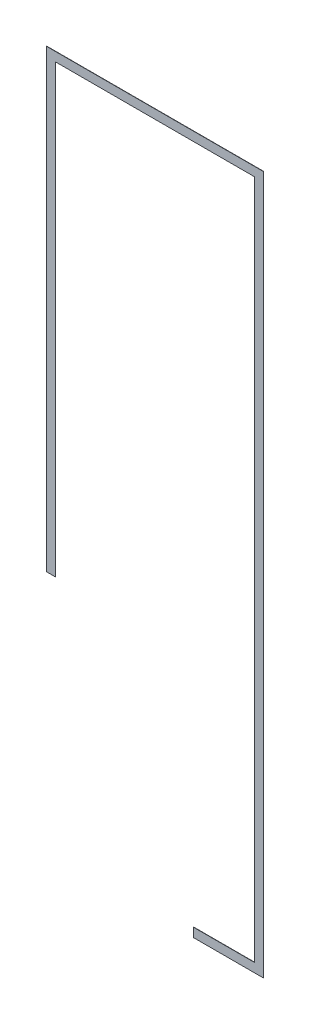
ISO-10303-21;
HEADER;
FILE_DESCRIPTION(('STEP AP214'),'2;1');
FILE_NAME('part.step','',(''),(''),'','','');
FILE_SCHEMA(('AUTOMOTIVE_DESIGN { 1 0 10303 214 1 1 1 1 }'));
ENDSEC;
DATA;
#1=APPLICATION_CONTEXT('core data for automotive mechanical design processes');
#2=APPLICATION_PROTOCOL_DEFINITION('international standard','automotive_design',2000,#1);
#3=PRODUCT_CONTEXT('',#1,'mechanical');
#4=PRODUCT('Part','Part','',(#3));
#5=PRODUCT_RELATED_PRODUCT_CATEGORY('part','',(#4));
#6=PRODUCT_DEFINITION_FORMATION('','',#4);
#7=PRODUCT_DEFINITION_CONTEXT('part definition',#1,'design');
#8=PRODUCT_DEFINITION('design','',#6,#7);
#9=PRODUCT_DEFINITION_SHAPE('','',#8);
#10=(LENGTH_UNIT() NAMED_UNIT(*) SI_UNIT(.MILLI.,.METRE.));
#11=(NAMED_UNIT(*) PLANE_ANGLE_UNIT() SI_UNIT($,.RADIAN.));
#12=(NAMED_UNIT(*) SI_UNIT($,.STERADIAN.) SOLID_ANGLE_UNIT());
#13=UNCERTAINTY_MEASURE_WITH_UNIT(LENGTH_MEASURE(1.E-05),#10,'distance_accuracy_value','');
#14=(GEOMETRIC_REPRESENTATION_CONTEXT(3) GLOBAL_UNCERTAINTY_ASSIGNED_CONTEXT((#13)) GLOBAL_UNIT_ASSIGNED_CONTEXT((#10,
#11,#12)) REPRESENTATION_CONTEXT('',''));
#15=CARTESIAN_POINT('',(0.,0.,0.));
#16=DIRECTION('',(0.,0.,1.));
#17=DIRECTION('',(1.,0.,0.));
#18=AXIS2_PLACEMENT_3D('',#15,#16,#17);
#19=CARTESIAN_POINT('',(5890.08691054199,-2228.56735908509,1.5875));
#20=DIRECTION('',(0.,0.,1.));
#21=DIRECTION('',(1.,0.,0.));
#22=AXIS2_PLACEMENT_3D('',#19,#20,#21);
#23=PLANE('',#22);
#24=DIRECTION('',(0.,1.,0.));
#25=VECTOR('',#24,1.);
#26=CARTESIAN_POINT('',(6108.37451054199,-4171.66735908507,1.5875));
#27=LINE('',#26,#25);
#28=CARTESIAN_POINT('',(6108.37451054199,-4197.06735908507,1.5875));
#29=VERTEX_POINT('',#28);
#30=CARTESIAN_POINT('',(6108.37451054199,-4146.26735908507,1.5875));
#31=VERTEX_POINT('',#30);
#32=EDGE_CURVE('E130',#29,#31,#27,.T.);
#33=ORIENTED_EDGE('',*,*,#32,.F.);
#34=DIRECTION('',(1.,0.,0.));
#35=VECTOR('',#34,1.);
#36=CARTESIAN_POINT('',(6305.22451054199,-4197.06735908507,1.5875));
#37=LINE('',#36,#35);
#38=CARTESIAN_POINT('',(6502.07451054199,-4197.06735908507,1.5875));
#39=VERTEX_POINT('',#38);
#40=EDGE_CURVE('E134',#39,#29,#37,.F.);
#41=ORIENTED_EDGE('',*,*,#40,.F.);
#42=DIRECTION('',(0.,1.,0.));
#43=VECTOR('',#42,1.);
#44=CARTESIAN_POINT('',(6502.07451054199,-2228.56735908509,1.5875));
#45=LINE('',#44,#43);
#46=CARTESIAN_POINT('',(6502.07451054199,-260.067359085082,1.5875));
#47=VERTEX_POINT('',#46);
#48=EDGE_CURVE('E138',#47,#39,#45,.F.);
#49=ORIENTED_EDGE('',*,*,#48,.F.);
#50=DIRECTION('',(-1.,0.,0.));
#51=VECTOR('',#50,1.);
#52=CARTESIAN_POINT('',(5890.08691054199,-260.067359085082,1.5875));
#53=LINE('',#52,#51);
#54=CARTESIAN_POINT('',(5278.09931054199,-260.067359085082,1.5875));
#55=VERTEX_POINT('',#54);
#56=EDGE_CURVE('E107',#55,#47,#53,.F.);
#57=ORIENTED_EDGE('',*,*,#56,.F.);
#58=DIRECTION('',(0.,1.,0.));
#59=VECTOR('',#58,1.);
#60=CARTESIAN_POINT('',(5278.09931054199,-1542.76735908508,1.5875));
#61=LINE('',#60,#59);
#62=CARTESIAN_POINT('',(5278.09931054199,-2825.46735908507,1.5875));
#63=VERTEX_POINT('',#62);
#64=EDGE_CURVE('E20',#63,#55,#61,.T.);
#65=ORIENTED_EDGE('',*,*,#64,.F.);
#66=DIRECTION('',(1.,0.,0.));
#67=VECTOR('',#66,1.);
#68=CARTESIAN_POINT('',(5303.49931054199,-2825.46735908507,1.5875));
#69=LINE('',#68,#67);
#70=CARTESIAN_POINT('',(5328.89931054199,-2825.46735908507,1.5875));
#71=VERTEX_POINT('',#70);
#72=EDGE_CURVE('E95',#71,#63,#69,.F.);
#73=ORIENTED_EDGE('',*,*,#72,.F.);
#74=DIRECTION('',(0.,1.,0.));
#75=VECTOR('',#74,1.);
#76=CARTESIAN_POINT('',(5328.89931054199,-1568.16735908509,1.5875));
#77=LINE('',#76,#75);
#78=CARTESIAN_POINT('',(5328.89931054199,-310.867359085082,1.5875));
#79=VERTEX_POINT('',#78);
#80=EDGE_CURVE('E90',#79,#71,#77,.F.);
#81=ORIENTED_EDGE('',*,*,#80,.F.);
#82=DIRECTION('',(1.,0.,0.));
#83=VECTOR('',#82,1.);
#84=CARTESIAN_POINT('',(5890.08691054199,-310.867359085082,1.5875));
#85=LINE('',#84,#83);
#86=CARTESIAN_POINT('',(6451.27451054199,-310.867359085082,1.5875));
#87=VERTEX_POINT('',#86);
#88=EDGE_CURVE('E118',#87,#79,#85,.F.);
#89=ORIENTED_EDGE('',*,*,#88,.F.);
#90=DIRECTION('',(0.,-1.,0.));
#91=VECTOR('',#90,1.);
#92=CARTESIAN_POINT('',(6451.27451054199,-2228.56735908509,1.5875));
#93=LINE('',#92,#91);
#94=CARTESIAN_POINT('',(6451.27451054199,-4146.26735908507,1.5875));
#95=VERTEX_POINT('',#94);
#96=EDGE_CURVE('E122',#95,#87,#93,.F.);
#97=ORIENTED_EDGE('',*,*,#96,.F.);
#98=DIRECTION('',(1.,0.,0.));
#99=VECTOR('',#98,1.);
#100=CARTESIAN_POINT('',(6279.82451054199,-4146.26735908507,1.5875));
#101=LINE('',#100,#99);
#102=EDGE_CURVE('E126',#31,#95,#101,.T.);
#103=ORIENTED_EDGE('',*,*,#102,.F.);
#104=EDGE_LOOP('',(#33,#41,#49,#57,#65,#73,#81,#89,#97,#103));
#105=FACE_BOUND('',#104,.T.);
#106=ADVANCED_FACE('F17',(#105),#23,.T.);
#107=CARTESIAN_POINT('',(5278.09931054199,-1542.76735908508,6.35));
#108=DIRECTION('',(-1.,0.,0.));
#109=DIRECTION('',(0.,0.,1.));
#110=AXIS2_PLACEMENT_3D('',#107,#108,#109);
#111=PLANE('',#110);
#112=DIRECTION('',(0.,1.,0.));
#113=VECTOR('',#112,1.);
#114=CARTESIAN_POINT('',(5278.09931054199,-2228.56735908509,0.));
#115=LINE('',#114,#113);
#116=CARTESIAN_POINT('',(5278.09931054199,-260.067359085082,0.));
#117=VERTEX_POINT('',#116);
#118=CARTESIAN_POINT('',(5278.09931054199,-2825.46735908507,0.));
#119=VERTEX_POINT('',#118);
#120=EDGE_CURVE('E113',#117,#119,#115,.F.);
#121=ORIENTED_EDGE('',*,*,#120,.T.);
#122=DIRECTION('',(0.,0.,-1.));
#123=VECTOR('',#122,1.);
#124=CARTESIAN_POINT('',(5278.09931054199,-2825.46735908507,6.35));
#125=LINE('',#124,#123);
#126=EDGE_CURVE('E100',#63,#119,#125,.T.);
#127=ORIENTED_EDGE('',*,*,#126,.F.);
#128=ORIENTED_EDGE('',*,*,#64,.T.);
#129=DIRECTION('',(0.,0.,1.));
#130=VECTOR('',#129,1.);
#131=CARTESIAN_POINT('',(5278.09931054199,-260.067359085083,6.35));
#132=LINE('',#131,#130);
#133=EDGE_CURVE('E144',#117,#55,#132,.T.);
#134=ORIENTED_EDGE('',*,*,#133,.F.);
#135=EDGE_LOOP('',(#121,#127,#128,#134));
#136=FACE_BOUND('',#135,.T.);
#137=ADVANCED_FACE('F112',(#136),#111,.T.);
#138=CARTESIAN_POINT('',(5303.49931054199,-2825.46735908507,6.35));
#139=DIRECTION('',(0.,-1.,0.));
#140=DIRECTION('',(0.,0.,-1.));
#141=AXIS2_PLACEMENT_3D('',#138,#139,#140);
#142=PLANE('',#141);
#143=DIRECTION('',(1.,0.,0.));
#144=VECTOR('',#143,1.);
#145=CARTESIAN_POINT('',(5890.08691054199,-2825.46735908507,0.));
#146=LINE('',#145,#144);
#147=CARTESIAN_POINT('',(5328.89931054199,-2825.46735908507,0.));
#148=VERTEX_POINT('',#147);
#149=EDGE_CURVE('E147',#119,#148,#146,.T.);
#150=ORIENTED_EDGE('',*,*,#149,.T.);
#151=DIRECTION('',(0.,0.,-1.));
#152=VECTOR('',#151,1.);
#153=CARTESIAN_POINT('',(5328.89931054199,-2825.46735908507,6.35));
#154=LINE('',#153,#152);
#155=EDGE_CURVE('E102',#71,#148,#154,.T.);
#156=ORIENTED_EDGE('',*,*,#155,.F.);
#157=ORIENTED_EDGE('',*,*,#72,.T.);
#158=ORIENTED_EDGE('',*,*,#126,.T.);
#159=EDGE_LOOP('',(#150,#156,#157,#158));
#160=FACE_BOUND('',#159,.T.);
#161=ADVANCED_FACE('F98',(#160),#142,.T.);
#162=CARTESIAN_POINT('',(5328.89931054199,-1568.16735908509,6.35));
#163=DIRECTION('',(1.,0.,0.));
#164=DIRECTION('',(0.,0.,-1.));
#165=AXIS2_PLACEMENT_3D('',#162,#163,#164);
#166=PLANE('',#165);
#167=DIRECTION('',(0.,1.,0.));
#168=VECTOR('',#167,1.);
#169=CARTESIAN_POINT('',(5328.89931054199,-2228.56735908509,0.));
#170=LINE('',#169,#168);
#171=CARTESIAN_POINT('',(5328.89931054199,-310.867359085082,0.));
#172=VERTEX_POINT('',#171);
#173=EDGE_CURVE('E149',#148,#172,#170,.T.);
#174=ORIENTED_EDGE('',*,*,#173,.T.);
#175=DIRECTION('',(0.,0.,1.));
#176=VECTOR('',#175,1.);
#177=CARTESIAN_POINT('',(5328.89931054199,-310.867359085082,6.35));
#178=LINE('',#177,#176);
#179=EDGE_CURVE('E120',#79,#172,#178,.F.);
#180=ORIENTED_EDGE('',*,*,#179,.F.);
#181=ORIENTED_EDGE('',*,*,#80,.T.);
#182=ORIENTED_EDGE('',*,*,#155,.T.);
#183=EDGE_LOOP('',(#174,#180,#181,#182));
#184=FACE_BOUND('',#183,.T.);
#185=ADVANCED_FACE('F198',(#184),#166,.T.);
#186=CARTESIAN_POINT('',(5890.08691054199,-310.867359085082,6.35));
#187=DIRECTION('',(0.,-1.,0.));
#188=DIRECTION('',(1.,0.,0.));
#189=AXIS2_PLACEMENT_3D('',#186,#187,#188);
#190=PLANE('',#189);
#191=DIRECTION('',(1.,0.,0.));
#192=VECTOR('',#191,1.);
#193=CARTESIAN_POINT('',(5890.08691054199,-310.867359085082,0.));
#194=LINE('',#193,#192);
#195=CARTESIAN_POINT('',(6451.27451054199,-310.867359085082,0.));
#196=VERTEX_POINT('',#195);
#197=EDGE_CURVE('E152',#172,#196,#194,.T.);
#198=ORIENTED_EDGE('',*,*,#197,.T.);
#199=DIRECTION('',(0.,0.,1.));
#200=VECTOR('',#199,1.);
#201=CARTESIAN_POINT('',(6451.27451054199,-310.867359085082,6.35));
#202=LINE('',#201,#200);
#203=EDGE_CURVE('E124',#87,#196,#202,.F.);
#204=ORIENTED_EDGE('',*,*,#203,.F.);
#205=ORIENTED_EDGE('',*,*,#88,.T.);
#206=ORIENTED_EDGE('',*,*,#179,.T.);
#207=EDGE_LOOP('',(#198,#204,#205,#206));
#208=FACE_BOUND('',#207,.T.);
#209=ADVANCED_FACE('F197',(#208),#190,.T.);
#210=CARTESIAN_POINT('',(6451.27451054199,-2228.56735908509,6.35));
#211=DIRECTION('',(-1.,0.,0.));
#212=DIRECTION('',(0.,-1.,0.));
#213=AXIS2_PLACEMENT_3D('',#210,#211,#212);
#214=PLANE('',#213);
#215=DIRECTION('',(0.,1.,0.));
#216=VECTOR('',#215,1.);
#217=CARTESIAN_POINT('',(6451.27451054199,-2228.56735908509,0.));
#218=LINE('',#217,#216);
#219=CARTESIAN_POINT('',(6451.27451054199,-4146.26735908507,0.));
#220=VERTEX_POINT('',#219);
#221=EDGE_CURVE('E155',#196,#220,#218,.F.);
#222=ORIENTED_EDGE('',*,*,#221,.T.);
#223=DIRECTION('',(0.,0.,1.));
#224=VECTOR('',#223,1.);
#225=CARTESIAN_POINT('',(6451.27451054199,-4146.26735908507,6.35));
#226=LINE('',#225,#224);
#227=EDGE_CURVE('E128',#95,#220,#226,.F.);
#228=ORIENTED_EDGE('',*,*,#227,.F.);
#229=ORIENTED_EDGE('',*,*,#96,.T.);
#230=ORIENTED_EDGE('',*,*,#203,.T.);
#231=EDGE_LOOP('',(#222,#228,#229,#230));
#232=FACE_BOUND('',#231,.T.);
#233=ADVANCED_FACE('F191',(#232),#214,.T.);
#234=CARTESIAN_POINT('',(6279.82451054199,-4146.26735908507,6.35));
#235=DIRECTION('',(0.,1.,0.));
#236=DIRECTION('',(0.,0.,1.));
#237=AXIS2_PLACEMENT_3D('',#234,#235,#236);
#238=PLANE('',#237);
#239=DIRECTION('',(1.,0.,0.));
#240=VECTOR('',#239,1.);
#241=CARTESIAN_POINT('',(5890.08691054199,-4146.26735908507,0.));
#242=LINE('',#241,#240);
#243=CARTESIAN_POINT('',(6108.37451054199,-4146.26735908507,0.));
#244=VERTEX_POINT('',#243);
#245=EDGE_CURVE('E158',#220,#244,#242,.F.);
#246=ORIENTED_EDGE('',*,*,#245,.T.);
#247=DIRECTION('',(0.,0.,1.));
#248=VECTOR('',#247,1.);
#249=CARTESIAN_POINT('',(6108.37451054199,-4146.26735908507,6.35));
#250=LINE('',#249,#248);
#251=EDGE_CURVE('E132',#31,#244,#250,.F.);
#252=ORIENTED_EDGE('',*,*,#251,.F.);
#253=ORIENTED_EDGE('',*,*,#102,.T.);
#254=ORIENTED_EDGE('',*,*,#227,.T.);
#255=EDGE_LOOP('',(#246,#252,#253,#254));
#256=FACE_BOUND('',#255,.T.);
#257=ADVANCED_FACE('F187',(#256),#238,.T.);
#258=CARTESIAN_POINT('',(6108.37451054199,-4171.66735908507,6.35));
#259=DIRECTION('',(-1.,0.,0.));
#260=DIRECTION('',(0.,0.,1.));
#261=AXIS2_PLACEMENT_3D('',#258,#259,#260);
#262=PLANE('',#261);
#263=DIRECTION('',(0.,1.,0.));
#264=VECTOR('',#263,1.);
#265=CARTESIAN_POINT('',(6108.37451054199,-2228.56735908509,0.));
#266=LINE('',#265,#264);
#267=CARTESIAN_POINT('',(6108.37451054199,-4197.06735908507,0.));
#268=VERTEX_POINT('',#267);
#269=EDGE_CURVE('E161',#244,#268,#266,.F.);
#270=ORIENTED_EDGE('',*,*,#269,.T.);
#271=DIRECTION('',(0.,0.,-1.));
#272=VECTOR('',#271,1.);
#273=CARTESIAN_POINT('',(6108.37451054199,-4197.06735908507,6.35));
#274=LINE('',#273,#272);
#275=EDGE_CURVE('E136',#29,#268,#274,.T.);
#276=ORIENTED_EDGE('',*,*,#275,.F.);
#277=ORIENTED_EDGE('',*,*,#32,.T.);
#278=ORIENTED_EDGE('',*,*,#251,.T.);
#279=EDGE_LOOP('',(#270,#276,#277,#278));
#280=FACE_BOUND('',#279,.T.);
#281=ADVANCED_FACE('F181',(#280),#262,.T.);
#282=CARTESIAN_POINT('',(6305.22451054199,-4197.06735908507,6.35));
#283=DIRECTION('',(0.,-1.,0.));
#284=DIRECTION('',(0.,0.,-1.));
#285=AXIS2_PLACEMENT_3D('',#282,#283,#284);
#286=PLANE('',#285);
#287=DIRECTION('',(1.,0.,0.));
#288=VECTOR('',#287,1.);
#289=CARTESIAN_POINT('',(5890.08691054199,-4197.06735908507,0.));
#290=LINE('',#289,#288);
#291=CARTESIAN_POINT('',(6502.07451054199,-4197.06735908507,0.));
#292=VERTEX_POINT('',#291);
#293=EDGE_CURVE('E164',#268,#292,#290,.T.);
#294=ORIENTED_EDGE('',*,*,#293,.T.);
#295=DIRECTION('',(0.,0.,-1.));
#296=VECTOR('',#295,1.);
#297=CARTESIAN_POINT('',(6502.07451054199,-4197.06735908507,6.35));
#298=LINE('',#297,#296);
#299=EDGE_CURVE('E140',#39,#292,#298,.T.);
#300=ORIENTED_EDGE('',*,*,#299,.F.);
#301=ORIENTED_EDGE('',*,*,#40,.T.);
#302=ORIENTED_EDGE('',*,*,#275,.T.);
#303=EDGE_LOOP('',(#294,#300,#301,#302));
#304=FACE_BOUND('',#303,.T.);
#305=ADVANCED_FACE('F177',(#304),#286,.T.);
#306=CARTESIAN_POINT('',(6502.07451054199,-2228.56735908509,6.35));
#307=DIRECTION('',(1.,0.,0.));
#308=DIRECTION('',(0.,0.,-1.));
#309=AXIS2_PLACEMENT_3D('',#306,#307,#308);
#310=PLANE('',#309);
#311=DIRECTION('',(0.,1.,0.));
#312=VECTOR('',#311,1.);
#313=CARTESIAN_POINT('',(6502.07451054199,-2228.56735908509,0.));
#314=LINE('',#313,#312);
#315=CARTESIAN_POINT('',(6502.07451054199,-260.067359085082,0.));
#316=VERTEX_POINT('',#315);
#317=EDGE_CURVE('E26',#292,#316,#314,.T.);
#318=ORIENTED_EDGE('',*,*,#317,.T.);
#319=DIRECTION('',(0.,0.,1.));
#320=VECTOR('',#319,1.);
#321=CARTESIAN_POINT('',(6502.07451054199,-260.067359085082,6.35));
#322=LINE('',#321,#320);
#323=EDGE_CURVE('E34',#47,#316,#322,.F.);
#324=ORIENTED_EDGE('',*,*,#323,.F.);
#325=ORIENTED_EDGE('',*,*,#48,.T.);
#326=ORIENTED_EDGE('',*,*,#299,.T.);
#327=EDGE_LOOP('',(#318,#324,#325,#326));
#328=FACE_BOUND('',#327,.T.);
#329=ADVANCED_FACE('F170',(#328),#310,.T.);
#330=CARTESIAN_POINT('',(5890.08691054199,-260.067359085082,6.35));
#331=DIRECTION('',(0.,1.,0.));
#332=DIRECTION('',(-1.,0.,0.));
#333=AXIS2_PLACEMENT_3D('',#330,#331,#332);
#334=PLANE('',#333);
#335=DIRECTION('',(1.,0.,0.));
#336=VECTOR('',#335,1.);
#337=CARTESIAN_POINT('',(5890.08691054199,-260.067359085082,0.));
#338=LINE('',#337,#336);
#339=EDGE_CURVE('E11',#316,#117,#338,.F.);
#340=ORIENTED_EDGE('',*,*,#339,.T.);
#341=ORIENTED_EDGE('',*,*,#133,.T.);
#342=ORIENTED_EDGE('',*,*,#56,.T.);
#343=ORIENTED_EDGE('',*,*,#323,.T.);
#344=EDGE_LOOP('',(#340,#341,#342,#343));
#345=FACE_BOUND('',#344,.T.);
#346=ADVANCED_FACE('F199',(#345),#334,.T.);
#347=CARTESIAN_POINT('',(5890.08691054199,-2228.56735908509,0.));
#348=DIRECTION('',(0.,0.,1.));
#349=DIRECTION('',(1.,0.,0.));
#350=AXIS2_PLACEMENT_3D('',#347,#348,#349);
#351=PLANE('',#350);
#352=ORIENTED_EDGE('',*,*,#317,.F.);
#353=ORIENTED_EDGE('',*,*,#293,.F.);
#354=ORIENTED_EDGE('',*,*,#269,.F.);
#355=ORIENTED_EDGE('',*,*,#245,.F.);
#356=ORIENTED_EDGE('',*,*,#221,.F.);
#357=ORIENTED_EDGE('',*,*,#197,.F.);
#358=ORIENTED_EDGE('',*,*,#173,.F.);
#359=ORIENTED_EDGE('',*,*,#149,.F.);
#360=ORIENTED_EDGE('',*,*,#120,.F.);
#361=ORIENTED_EDGE('',*,*,#339,.F.);
#362=EDGE_LOOP('',(#352,#353,#354,#355,#356,#357,#358,#359,#360,#361));
#363=FACE_BOUND('',#362,.T.);
#364=ADVANCED_FACE('F174',(#363),#351,.F.);
#365=CLOSED_SHELL('',(#106,#137,#161,#185,#209,#233,#257,#281,#305,#329,#346,#364));
#366=MANIFOLD_SOLID_BREP('B1',#365);
#367=ADVANCED_BREP_SHAPE_REPRESENTATION('',(#18,#366),#14);
#368=SHAPE_DEFINITION_REPRESENTATION(#9,#367);
ENDSEC;
END-ISO-10303-21;
